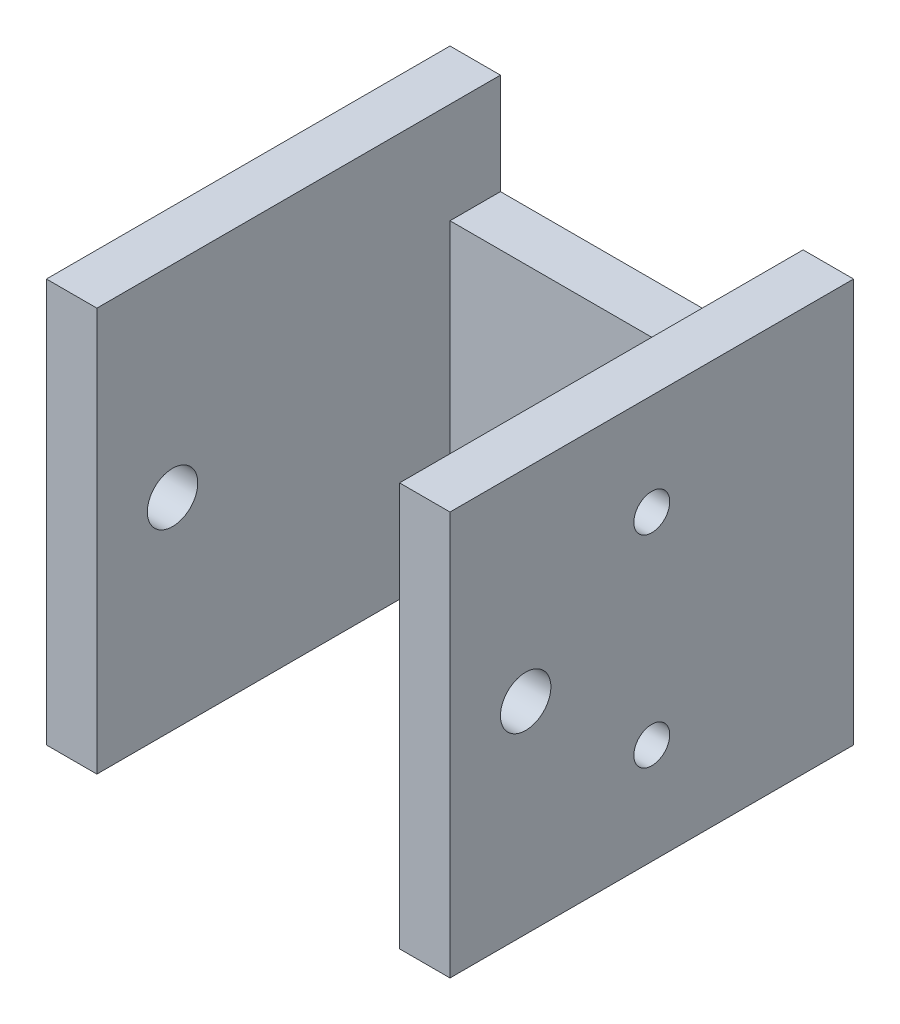
ISO-10303-21;
HEADER;
FILE_DESCRIPTION(('STEP AP214'),'2;1');
FILE_NAME('part.step','',(''),(''),'','','');
FILE_SCHEMA(('AUTOMOTIVE_DESIGN { 1 0 10303 214 1 1 1 1 }'));
ENDSEC;
DATA;
#1=APPLICATION_CONTEXT('core data for automotive mechanical design processes');
#2=APPLICATION_PROTOCOL_DEFINITION('international standard','automotive_design',2000,#1);
#3=PRODUCT_CONTEXT('',#1,'mechanical');
#4=PRODUCT('Part','Part','',(#3));
#5=PRODUCT_RELATED_PRODUCT_CATEGORY('part','',(#4));
#6=PRODUCT_DEFINITION_FORMATION('','',#4);
#7=PRODUCT_DEFINITION_CONTEXT('part definition',#1,'design');
#8=PRODUCT_DEFINITION('design','',#6,#7);
#9=PRODUCT_DEFINITION_SHAPE('','',#8);
#10=(LENGTH_UNIT() NAMED_UNIT(*) SI_UNIT(.MILLI.,.METRE.));
#11=(NAMED_UNIT(*) PLANE_ANGLE_UNIT() SI_UNIT($,.RADIAN.));
#12=(NAMED_UNIT(*) SI_UNIT($,.STERADIAN.) SOLID_ANGLE_UNIT());
#13=UNCERTAINTY_MEASURE_WITH_UNIT(LENGTH_MEASURE(1.E-05),#10,'distance_accuracy_value','');
#14=(GEOMETRIC_REPRESENTATION_CONTEXT(3) GLOBAL_UNCERTAINTY_ASSIGNED_CONTEXT((#13)) GLOBAL_UNIT_ASSIGNED_CONTEXT((#10,
#11,#12)) REPRESENTATION_CONTEXT('',''));
#15=CARTESIAN_POINT('',(0.,0.,0.));
#16=DIRECTION('',(0.,0.,1.));
#17=DIRECTION('',(1.,0.,0.));
#18=AXIS2_PLACEMENT_3D('',#15,#16,#17);
#19=CARTESIAN_POINT('',(0.,0.,0.));
#20=DIRECTION('',(0.,-1.,0.));
#21=DIRECTION('',(0.,0.,-1.));
#22=AXIS2_PLACEMENT_3D('',#19,#20,#21);
#23=PLANE('',#22);
#24=DIRECTION('',(-1.,0.,0.));
#25=VECTOR('',#24,1.);
#26=CARTESIAN_POINT('',(0.,0.,-25.4));
#27=LINE('',#26,#25);
#28=CARTESIAN_POINT('',(3.175,0.,-25.4));
#29=VERTEX_POINT('',#28);
#30=CARTESIAN_POINT('',(0.,0.,-25.4));
#31=VERTEX_POINT('',#30);
#32=EDGE_CURVE('E155',#29,#31,#27,.T.);
#33=ORIENTED_EDGE('',*,*,#32,.F.);
#34=DIRECTION('',(0.,0.,-1.));
#35=VECTOR('',#34,1.);
#36=CARTESIAN_POINT('',(3.175,0.,-22.225));
#37=LINE('',#36,#35);
#38=CARTESIAN_POINT('',(3.175,0.,0.));
#39=VERTEX_POINT('',#38);
#40=EDGE_CURVE('E147',#39,#29,#37,.T.);
#41=ORIENTED_EDGE('',*,*,#40,.F.);
#42=DIRECTION('',(1.,0.,0.));
#43=VECTOR('',#42,1.);
#44=CARTESIAN_POINT('',(3.175,0.,0.));
#45=LINE('',#44,#43);
#46=CARTESIAN_POINT('',(0.,0.,0.));
#47=VERTEX_POINT('',#46);
#48=EDGE_CURVE('E144',#47,#39,#45,.T.);
#49=ORIENTED_EDGE('',*,*,#48,.F.);
#50=DIRECTION('',(0.,0.,1.));
#51=VECTOR('',#50,1.);
#52=CARTESIAN_POINT('',(0.,0.,0.));
#53=LINE('',#52,#51);
#54=EDGE_CURVE('E89',#31,#47,#53,.T.);
#55=ORIENTED_EDGE('',*,*,#54,.F.);
#56=EDGE_LOOP('',(#33,#41,#49,#55));
#57=FACE_BOUND('',#56,.T.);
#58=ADVANCED_FACE('F39',(#57),#23,.T.);
#59=CARTESIAN_POINT('',(0.,25.4,0.));
#60=DIRECTION('',(0.,-1.,0.));
#61=DIRECTION('',(0.,0.,-1.));
#62=AXIS2_PLACEMENT_3D('',#59,#60,#61);
#63=PLANE('',#62);
#64=DIRECTION('',(0.,0.,-1.));
#65=VECTOR('',#64,1.);
#66=CARTESIAN_POINT('',(3.175,25.4,-22.225));
#67=LINE('',#66,#65);
#68=CARTESIAN_POINT('',(3.175,25.4,0.));
#69=VERTEX_POINT('',#68);
#70=CARTESIAN_POINT('',(3.175,25.4,-25.4));
#71=VERTEX_POINT('',#70);
#72=EDGE_CURVE('E97',#69,#71,#67,.T.);
#73=ORIENTED_EDGE('',*,*,#72,.T.);
#74=DIRECTION('',(-1.,0.,0.));
#75=VECTOR('',#74,1.);
#76=CARTESIAN_POINT('',(0.,25.4,-25.4));
#77=LINE('',#76,#75);
#78=CARTESIAN_POINT('',(0.,25.4,-25.4));
#79=VERTEX_POINT('',#78);
#80=EDGE_CURVE('E120',#71,#79,#77,.T.);
#81=ORIENTED_EDGE('',*,*,#80,.T.);
#82=DIRECTION('',(0.,0.,1.));
#83=VECTOR('',#82,1.);
#84=CARTESIAN_POINT('',(0.,25.4,0.));
#85=LINE('',#84,#83);
#86=CARTESIAN_POINT('',(0.,25.4,0.));
#87=VERTEX_POINT('',#86);
#88=EDGE_CURVE('E63',#79,#87,#85,.T.);
#89=ORIENTED_EDGE('',*,*,#88,.T.);
#90=DIRECTION('',(1.,0.,0.));
#91=VECTOR('',#90,1.);
#92=CARTESIAN_POINT('',(3.175,25.4,0.));
#93=LINE('',#92,#91);
#94=EDGE_CURVE('E159',#87,#69,#93,.T.);
#95=ORIENTED_EDGE('',*,*,#94,.T.);
#96=EDGE_LOOP('',(#73,#81,#89,#95));
#97=FACE_BOUND('',#96,.T.);
#98=ADVANCED_FACE('F209',(#97),#63,.F.);
#99=CARTESIAN_POINT('',(25.4,25.4,-25.4));
#100=DIRECTION('',(-1.,0.,0.));
#101=DIRECTION('',(0.,0.,1.));
#102=AXIS2_PLACEMENT_3D('',#99,#100,#101);
#103=PLANE('',#102);
#104=CARTESIAN_POINT('',(25.4,19.05,-12.7));
#105=DIRECTION('',(1.,0.,0.));
#106=DIRECTION('',(0.,0.,-1.));
#107=AXIS2_PLACEMENT_3D('',#104,#105,#106);
#108=CIRCLE('',#107,1.13029999999999);
#109=CARTESIAN_POINT('',(25.4,19.05,-13.8303));
#110=VERTEX_POINT('',#109);
#111=EDGE_CURVE('E254',#110,#110,#108,.T.);
#112=ORIENTED_EDGE('',*,*,#111,.F.);
#113=EDGE_LOOP('',(#112));
#114=FACE_BOUND('',#113,.T.);
#115=DIRECTION('',(0.,0.,-1.));
#116=VECTOR('',#115,1.);
#117=CARTESIAN_POINT('',(25.4,0.,-25.4));
#118=LINE('',#117,#116);
#119=CARTESIAN_POINT('',(25.4,0.,0.));
#120=VERTEX_POINT('',#119);
#121=CARTESIAN_POINT('',(25.4,0.,-25.4));
#122=VERTEX_POINT('',#121);
#123=EDGE_CURVE('E127',#120,#122,#118,.T.);
#124=ORIENTED_EDGE('',*,*,#123,.T.);
#125=DIRECTION('',(0.,-1.,0.));
#126=VECTOR('',#125,1.);
#127=CARTESIAN_POINT('',(25.4,25.4,-25.4));
#128=LINE('',#127,#126);
#129=CARTESIAN_POINT('',(25.4,25.4,-25.4));
#130=VERTEX_POINT('',#129);
#131=EDGE_CURVE('E123',#130,#122,#128,.T.);
#132=ORIENTED_EDGE('',*,*,#131,.F.);
#133=DIRECTION('',(0.,0.,-1.));
#134=VECTOR('',#133,1.);
#135=CARTESIAN_POINT('',(25.4,25.4,-25.4));
#136=LINE('',#135,#134);
#137=CARTESIAN_POINT('',(25.4,25.4,0.));
#138=VERTEX_POINT('',#137);
#139=EDGE_CURVE('E109',#138,#130,#136,.T.);
#140=ORIENTED_EDGE('',*,*,#139,.F.);
#141=DIRECTION('',(0.,-1.,0.));
#142=VECTOR('',#141,1.);
#143=CARTESIAN_POINT('',(25.4,25.4,0.));
#144=LINE('',#143,#142);
#145=EDGE_CURVE('E130',#138,#120,#144,.T.);
#146=ORIENTED_EDGE('',*,*,#145,.T.);
#147=EDGE_LOOP('',(#124,#132,#140,#146));
#148=FACE_BOUND('',#147,.T.);
#149=CARTESIAN_POINT('',(25.4,12.7,-4.7625));
#150=DIRECTION('',(-1.,0.,0.));
#151=DIRECTION('',(0.,0.,1.));
#152=AXIS2_PLACEMENT_3D('',#149,#150,#151);
#153=CIRCLE('',#152,1.58749999999998);
#154=CARTESIAN_POINT('',(25.4,12.7,-3.17500000000001));
#155=VERTEX_POINT('',#154);
#156=EDGE_CURVE('E269',#155,#155,#153,.T.);
#157=ORIENTED_EDGE('',*,*,#156,.T.);
#158=EDGE_LOOP('',(#157));
#159=FACE_BOUND('',#158,.T.);
#160=CARTESIAN_POINT('',(25.4,6.35,-12.7));
#161=DIRECTION('',(1.,0.,0.));
#162=DIRECTION('',(0.,0.,-1.));
#163=AXIS2_PLACEMENT_3D('',#160,#161,#162);
#164=CIRCLE('',#163,1.13029999999999);
#165=CARTESIAN_POINT('',(25.4,6.35,-13.8303));
#166=VERTEX_POINT('',#165);
#167=EDGE_CURVE('E260',#166,#166,#164,.T.);
#168=ORIENTED_EDGE('',*,*,#167,.F.);
#169=EDGE_LOOP('',(#168));
#170=FACE_BOUND('',#169,.T.);
#171=ADVANCED_FACE('F124',(#114,#148,#159,#170),#103,.F.);
#172=CARTESIAN_POINT('',(3.175,25.4,0.));
#173=DIRECTION('',(0.,0.,-1.));
#174=DIRECTION('',(-1.,0.,0.));
#175=AXIS2_PLACEMENT_3D('',#172,#173,#174);
#176=PLANE('',#175);
#177=ORIENTED_EDGE('',*,*,#48,.T.);
#178=DIRECTION('',(0.,-1.,0.));
#179=VECTOR('',#178,1.);
#180=CARTESIAN_POINT('',(3.175,25.4,0.));
#181=LINE('',#180,#179);
#182=EDGE_CURVE('E11',#69,#39,#181,.T.);
#183=ORIENTED_EDGE('',*,*,#182,.F.);
#184=ORIENTED_EDGE('',*,*,#94,.F.);
#185=DIRECTION('',(0.,-1.,0.));
#186=VECTOR('',#185,1.);
#187=CARTESIAN_POINT('',(0.,25.4,0.));
#188=LINE('',#187,#186);
#189=EDGE_CURVE('E140',#87,#47,#188,.T.);
#190=ORIENTED_EDGE('',*,*,#189,.T.);
#191=EDGE_LOOP('',(#177,#183,#184,#190));
#192=FACE_BOUND('',#191,.T.);
#193=ADVANCED_FACE('F41',(#192),#176,.F.);
#194=CARTESIAN_POINT('',(3.175,25.4,-22.225));
#195=DIRECTION('',(-1.,0.,0.));
#196=DIRECTION('',(0.,0.,1.));
#197=AXIS2_PLACEMENT_3D('',#194,#195,#196);
#198=PLANE('',#197);
#199=CARTESIAN_POINT('',(3.175,12.7,-4.7625));
#200=DIRECTION('',(-1.,0.,0.));
#201=DIRECTION('',(0.,0.,1.));
#202=AXIS2_PLACEMENT_3D('',#199,#200,#201);
#203=CIRCLE('',#202,1.58749999999999);
#204=CARTESIAN_POINT('',(3.175,12.7,-3.17500000000001));
#205=VERTEX_POINT('',#204);
#206=EDGE_CURVE('E148',#205,#205,#203,.T.);
#207=ORIENTED_EDGE('',*,*,#206,.T.);
#208=EDGE_LOOP('',(#207));
#209=FACE_BOUND('',#208,.T.);
#210=ORIENTED_EDGE('',*,*,#40,.T.);
#211=DIRECTION('',(0.,1.,0.));
#212=VECTOR('',#211,1.);
#213=CARTESIAN_POINT('',(3.175,0.,-25.4));
#214=LINE('',#213,#212);
#215=CARTESIAN_POINT('',(3.175,6.35,-25.4));
#216=VERTEX_POINT('',#215);
#217=EDGE_CURVE('E238',#29,#216,#214,.T.);
#218=ORIENTED_EDGE('',*,*,#217,.T.);
#219=DIRECTION('',(0.,0.,1.));
#220=VECTOR('',#219,1.);
#221=CARTESIAN_POINT('',(3.175,6.35,-25.401));
#222=LINE('',#221,#220);
#223=CARTESIAN_POINT('',(3.175,6.35,-22.225));
#224=VERTEX_POINT('',#223);
#225=EDGE_CURVE('E193',#216,#224,#222,.T.);
#226=ORIENTED_EDGE('',*,*,#225,.T.);
#227=DIRECTION('',(0.,-1.,0.));
#228=VECTOR('',#227,1.);
#229=CARTESIAN_POINT('',(3.175,25.4,-22.225));
#230=LINE('',#229,#228);
#231=CARTESIAN_POINT('',(3.175,19.05,-22.225));
#232=VERTEX_POINT('',#231);
#233=EDGE_CURVE('E47',#232,#224,#230,.T.);
#234=ORIENTED_EDGE('',*,*,#233,.F.);
#235=DIRECTION('',(0.,0.,1.));
#236=VECTOR('',#235,1.);
#237=CARTESIAN_POINT('',(3.175,19.05,-25.401));
#238=LINE('',#237,#236);
#239=CARTESIAN_POINT('',(3.175,19.05,-25.4));
#240=VERTEX_POINT('',#239);
#241=EDGE_CURVE('E189',#240,#232,#238,.T.);
#242=ORIENTED_EDGE('',*,*,#241,.F.);
#243=DIRECTION('',(0.,1.,0.));
#244=VECTOR('',#243,1.);
#245=CARTESIAN_POINT('',(3.175,25.4,-25.4));
#246=LINE('',#245,#244);
#247=EDGE_CURVE('E216',#240,#71,#246,.T.);
#248=ORIENTED_EDGE('',*,*,#247,.T.);
#249=ORIENTED_EDGE('',*,*,#72,.F.);
#250=ORIENTED_EDGE('',*,*,#182,.T.);
#251=EDGE_LOOP('',(#210,#218,#226,#234,#242,#248,#249,#250));
#252=FACE_BOUND('',#251,.T.);
#253=ADVANCED_FACE('F186',(#209,#252),#198,.F.);
#254=CARTESIAN_POINT('',(22.225,25.4,-22.225));
#255=DIRECTION('',(0.,0.,-1.));
#256=DIRECTION('',(-1.,0.,0.));
#257=AXIS2_PLACEMENT_3D('',#254,#255,#256);
#258=PLANE('',#257);
#259=ORIENTED_EDGE('',*,*,#233,.T.);
#260=DIRECTION('',(-1.,0.,0.));
#261=VECTOR('',#260,1.);
#262=CARTESIAN_POINT('',(3.175,6.35,-22.225));
#263=LINE('',#262,#261);
#264=CARTESIAN_POINT('',(22.225,6.35,-22.225));
#265=VERTEX_POINT('',#264);
#266=EDGE_CURVE('E178',#265,#224,#263,.T.);
#267=ORIENTED_EDGE('',*,*,#266,.F.);
#268=DIRECTION('',(0.,-1.,0.));
#269=VECTOR('',#268,1.);
#270=CARTESIAN_POINT('',(22.225,25.4,-22.225));
#271=LINE('',#270,#269);
#272=CARTESIAN_POINT('',(22.225,19.05,-22.225));
#273=VERTEX_POINT('',#272);
#274=EDGE_CURVE('E166',#273,#265,#271,.T.);
#275=ORIENTED_EDGE('',*,*,#274,.F.);
#276=DIRECTION('',(1.,0.,0.));
#277=VECTOR('',#276,1.);
#278=CARTESIAN_POINT('',(3.175,19.05,-22.225));
#279=LINE('',#278,#277);
#280=EDGE_CURVE('E181',#232,#273,#279,.T.);
#281=ORIENTED_EDGE('',*,*,#280,.F.);
#282=EDGE_LOOP('',(#259,#267,#275,#281));
#283=FACE_BOUND('',#282,.T.);
#284=ADVANCED_FACE('F174',(#283),#258,.F.);
#285=CARTESIAN_POINT('',(22.225,25.4,0.));
#286=DIRECTION('',(1.,0.,0.));
#287=DIRECTION('',(0.,0.,-1.));
#288=AXIS2_PLACEMENT_3D('',#285,#286,#287);
#289=PLANE('',#288);
#290=CARTESIAN_POINT('',(22.225,19.05,-12.7));
#291=DIRECTION('',(1.,0.,0.));
#292=DIRECTION('',(0.,0.,-1.));
#293=AXIS2_PLACEMENT_3D('',#290,#291,#292);
#294=CIRCLE('',#293,1.13029999999999);
#295=CARTESIAN_POINT('',(22.225,19.05,-13.8303));
#296=VERTEX_POINT('',#295);
#297=EDGE_CURVE('E257',#296,#296,#294,.T.);
#298=ORIENTED_EDGE('',*,*,#297,.T.);
#299=EDGE_LOOP('',(#298));
#300=FACE_BOUND('',#299,.T.);
#301=CARTESIAN_POINT('',(22.225,6.35,-12.7));
#302=DIRECTION('',(1.,0.,0.));
#303=DIRECTION('',(0.,0.,-1.));
#304=AXIS2_PLACEMENT_3D('',#301,#302,#303);
#305=CIRCLE('',#304,1.13029999999999);
#306=CARTESIAN_POINT('',(22.225,6.35,-13.8303));
#307=VERTEX_POINT('',#306);
#308=EDGE_CURVE('E263',#307,#307,#305,.T.);
#309=ORIENTED_EDGE('',*,*,#308,.T.);
#310=EDGE_LOOP('',(#309));
#311=FACE_BOUND('',#310,.T.);
#312=CARTESIAN_POINT('',(22.225,12.7,-4.7625));
#313=DIRECTION('',(1.,0.,0.));
#314=DIRECTION('',(0.,0.,-1.));
#315=AXIS2_PLACEMENT_3D('',#312,#313,#314);
#316=CIRCLE('',#315,1.58749999999999);
#317=CARTESIAN_POINT('',(22.225,12.7,-6.34999999999999));
#318=VERTEX_POINT('',#317);
#319=EDGE_CURVE('E271',#318,#318,#316,.T.);
#320=ORIENTED_EDGE('',*,*,#319,.T.);
#321=EDGE_LOOP('',(#320));
#322=FACE_BOUND('',#321,.T.);
#323=DIRECTION('',(0.,0.,1.));
#324=VECTOR('',#323,1.);
#325=CARTESIAN_POINT('',(22.225,0.,0.));
#326=LINE('',#325,#324);
#327=CARTESIAN_POINT('',(22.225,0.,-25.4));
#328=VERTEX_POINT('',#327);
#329=CARTESIAN_POINT('',(22.225,0.,0.));
#330=VERTEX_POINT('',#329);
#331=EDGE_CURVE('E54',#328,#330,#326,.T.);
#332=ORIENTED_EDGE('',*,*,#331,.T.);
#333=DIRECTION('',(0.,-1.,0.));
#334=VECTOR('',#333,1.);
#335=CARTESIAN_POINT('',(22.225,25.4,0.));
#336=LINE('',#335,#334);
#337=CARTESIAN_POINT('',(22.225,25.4,0.));
#338=VERTEX_POINT('',#337);
#339=EDGE_CURVE('E163',#338,#330,#336,.T.);
#340=ORIENTED_EDGE('',*,*,#339,.F.);
#341=DIRECTION('',(0.,0.,1.));
#342=VECTOR('',#341,1.);
#343=CARTESIAN_POINT('',(22.225,25.4,0.));
#344=LINE('',#343,#342);
#345=CARTESIAN_POINT('',(22.225,25.4,-25.4));
#346=VERTEX_POINT('',#345);
#347=EDGE_CURVE('E208',#346,#338,#344,.T.);
#348=ORIENTED_EDGE('',*,*,#347,.F.);
#349=DIRECTION('',(0.,-1.,0.));
#350=VECTOR('',#349,1.);
#351=CARTESIAN_POINT('',(22.225,25.4,-25.4));
#352=LINE('',#351,#350);
#353=CARTESIAN_POINT('',(22.225,19.05,-25.4));
#354=VERTEX_POINT('',#353);
#355=EDGE_CURVE('E138',#346,#354,#352,.T.);
#356=ORIENTED_EDGE('',*,*,#355,.T.);
#357=DIRECTION('',(0.,0.,1.));
#358=VECTOR('',#357,1.);
#359=CARTESIAN_POINT('',(22.225,19.05,-25.401));
#360=LINE('',#359,#358);
#361=EDGE_CURVE('E249',#354,#273,#360,.T.);
#362=ORIENTED_EDGE('',*,*,#361,.T.);
#363=ORIENTED_EDGE('',*,*,#274,.T.);
#364=DIRECTION('',(0.,0.,1.));
#365=VECTOR('',#364,1.);
#366=CARTESIAN_POINT('',(22.225,6.35,-25.401));
#367=LINE('',#366,#365);
#368=CARTESIAN_POINT('',(22.225,6.35,-25.4));
#369=VERTEX_POINT('',#368);
#370=EDGE_CURVE('E243',#369,#265,#367,.T.);
#371=ORIENTED_EDGE('',*,*,#370,.F.);
#372=DIRECTION('',(0.,-1.,0.));
#373=VECTOR('',#372,1.);
#374=CARTESIAN_POINT('',(22.225,0.,-25.4));
#375=LINE('',#374,#373);
#376=EDGE_CURVE('E232',#369,#328,#375,.T.);
#377=ORIENTED_EDGE('',*,*,#376,.T.);
#378=EDGE_LOOP('',(#332,#340,#348,#356,#362,#363,#371,#377));
#379=FACE_BOUND('',#378,.T.);
#380=ADVANCED_FACE('F227',(#300,#311,#322,#379),#289,.F.);
#381=CARTESIAN_POINT('',(25.4,25.4,0.));
#382=DIRECTION('',(0.,0.,-1.));
#383=DIRECTION('',(-1.,0.,0.));
#384=AXIS2_PLACEMENT_3D('',#381,#382,#383);
#385=PLANE('',#384);
#386=DIRECTION('',(1.,0.,0.));
#387=VECTOR('',#386,1.);
#388=CARTESIAN_POINT('',(25.4,0.,0.));
#389=LINE('',#388,#387);
#390=EDGE_CURVE('E152',#330,#120,#389,.T.);
#391=ORIENTED_EDGE('',*,*,#390,.T.);
#392=ORIENTED_EDGE('',*,*,#145,.F.);
#393=DIRECTION('',(1.,0.,0.));
#394=VECTOR('',#393,1.);
#395=CARTESIAN_POINT('',(25.4,25.4,0.));
#396=LINE('',#395,#394);
#397=EDGE_CURVE('E116',#338,#138,#396,.T.);
#398=ORIENTED_EDGE('',*,*,#397,.F.);
#399=ORIENTED_EDGE('',*,*,#339,.T.);
#400=EDGE_LOOP('',(#391,#392,#398,#399));
#401=FACE_BOUND('',#400,.T.);
#402=ADVANCED_FACE('F229',(#401),#385,.F.);
#403=CARTESIAN_POINT('',(0.,25.4,-25.4));
#404=DIRECTION('',(0.,0.,1.));
#405=DIRECTION('',(1.,0.,0.));
#406=AXIS2_PLACEMENT_3D('',#403,#404,#405);
#407=PLANE('',#406);
#408=DIRECTION('',(1.,0.,0.));
#409=VECTOR('',#408,1.);
#410=CARTESIAN_POINT('',(3.175,6.35,-25.4));
#411=LINE('',#410,#409);
#412=EDGE_CURVE('E234',#216,#369,#411,.T.);
#413=ORIENTED_EDGE('',*,*,#412,.F.);
#414=ORIENTED_EDGE('',*,*,#217,.F.);
#415=ORIENTED_EDGE('',*,*,#32,.T.);
#416=DIRECTION('',(0.,-1.,0.));
#417=VECTOR('',#416,1.);
#418=CARTESIAN_POINT('',(0.,25.4,-25.4));
#419=LINE('',#418,#417);
#420=EDGE_CURVE('E131',#79,#31,#419,.T.);
#421=ORIENTED_EDGE('',*,*,#420,.F.);
#422=ORIENTED_EDGE('',*,*,#80,.F.);
#423=ORIENTED_EDGE('',*,*,#247,.F.);
#424=DIRECTION('',(-1.,0.,0.));
#425=VECTOR('',#424,1.);
#426=CARTESIAN_POINT('',(3.175,19.05,-25.4));
#427=LINE('',#426,#425);
#428=EDGE_CURVE('E251',#354,#240,#427,.T.);
#429=ORIENTED_EDGE('',*,*,#428,.F.);
#430=ORIENTED_EDGE('',*,*,#355,.F.);
#431=EDGE_CURVE('E114',#130,#346,#77,.T.);
#432=ORIENTED_EDGE('',*,*,#431,.F.);
#433=ORIENTED_EDGE('',*,*,#131,.T.);
#434=EDGE_CURVE('E156',#122,#328,#27,.T.);
#435=ORIENTED_EDGE('',*,*,#434,.T.);
#436=ORIENTED_EDGE('',*,*,#376,.F.);
#437=EDGE_LOOP('',(#413,#414,#415,#421,#422,#423,#429,#430,#432,#433,#435,#436));
#438=FACE_BOUND('',#437,.T.);
#439=ADVANCED_FACE('F135',(#438),#407,.F.);
#440=CARTESIAN_POINT('',(0.,25.4,0.));
#441=DIRECTION('',(1.,0.,0.));
#442=DIRECTION('',(0.,0.,-1.));
#443=AXIS2_PLACEMENT_3D('',#440,#441,#442);
#444=PLANE('',#443);
#445=CARTESIAN_POINT('',(0.,12.7,-4.7625));
#446=DIRECTION('',(-1.,0.,0.));
#447=DIRECTION('',(0.,0.,1.));
#448=AXIS2_PLACEMENT_3D('',#445,#446,#447);
#449=CIRCLE('',#448,1.58749999999999);
#450=CARTESIAN_POINT('',(0.,12.7,-3.17500000000001));
#451=VERTEX_POINT('',#450);
#452=EDGE_CURVE('E266',#451,#451,#449,.T.);
#453=ORIENTED_EDGE('',*,*,#452,.F.);
#454=EDGE_LOOP('',(#453));
#455=FACE_BOUND('',#454,.T.);
#456=ORIENTED_EDGE('',*,*,#54,.T.);
#457=ORIENTED_EDGE('',*,*,#189,.F.);
#458=ORIENTED_EDGE('',*,*,#88,.F.);
#459=ORIENTED_EDGE('',*,*,#420,.T.);
#460=EDGE_LOOP('',(#456,#457,#458,#459));
#461=FACE_BOUND('',#460,.T.);
#462=ADVANCED_FACE('F220',(#455,#461),#444,.F.);
#463=ORIENTED_EDGE('',*,*,#431,.T.);
#464=ORIENTED_EDGE('',*,*,#347,.T.);
#465=ORIENTED_EDGE('',*,*,#397,.T.);
#466=ORIENTED_EDGE('',*,*,#139,.T.);
#467=EDGE_LOOP('',(#463,#464,#465,#466));
#468=FACE_BOUND('',#467,.T.);
#469=ADVANCED_FACE('F111',(#468),#63,.F.);
#470=ORIENTED_EDGE('',*,*,#331,.F.);
#471=ORIENTED_EDGE('',*,*,#434,.F.);
#472=ORIENTED_EDGE('',*,*,#123,.F.);
#473=ORIENTED_EDGE('',*,*,#390,.F.);
#474=EDGE_LOOP('',(#470,#471,#472,#473));
#475=FACE_BOUND('',#474,.T.);
#476=ADVANCED_FACE('F230',(#475),#23,.T.);
#477=CARTESIAN_POINT('',(0.,12.7,-4.7625));
#478=DIRECTION('',(-1.,0.,0.));
#479=DIRECTION('',(0.,0.,1.));
#480=AXIS2_PLACEMENT_3D('',#477,#478,#479);
#481=CYLINDRICAL_SURFACE('',#480,1.58749999999999);
#482=ORIENTED_EDGE('',*,*,#452,.T.);
#483=EDGE_LOOP('',(#482));
#484=FACE_BOUND('',#483,.T.);
#485=ORIENTED_EDGE('',*,*,#206,.F.);
#486=EDGE_LOOP('',(#485));
#487=FACE_BOUND('',#486,.T.);
#488=ADVANCED_FACE('F279',(#484,#487),#481,.F.);
#489=ORIENTED_EDGE('',*,*,#156,.F.);
#490=EDGE_LOOP('',(#489));
#491=FACE_BOUND('',#490,.T.);
#492=ORIENTED_EDGE('',*,*,#319,.F.);
#493=EDGE_LOOP('',(#492));
#494=FACE_BOUND('',#493,.T.);
#495=ADVANCED_FACE('F281',(#491,#494),#481,.F.);
#496=CARTESIAN_POINT('',(25.4,6.35,-12.7));
#497=DIRECTION('',(1.,0.,0.));
#498=DIRECTION('',(0.,0.,-1.));
#499=AXIS2_PLACEMENT_3D('',#496,#497,#498);
#500=CYLINDRICAL_SURFACE('',#499,1.13029999999999);
#501=ORIENTED_EDGE('',*,*,#308,.F.);
#502=EDGE_LOOP('',(#501));
#503=FACE_BOUND('',#502,.T.);
#504=ORIENTED_EDGE('',*,*,#167,.T.);
#505=EDGE_LOOP('',(#504));
#506=FACE_BOUND('',#505,.T.);
#507=ADVANCED_FACE('F288',(#503,#506),#500,.F.);
#508=CARTESIAN_POINT('',(25.4,19.05,-12.7));
#509=DIRECTION('',(1.,0.,0.));
#510=DIRECTION('',(0.,0.,-1.));
#511=AXIS2_PLACEMENT_3D('',#508,#509,#510);
#512=CYLINDRICAL_SURFACE('',#511,1.13029999999999);
#513=ORIENTED_EDGE('',*,*,#297,.F.);
#514=EDGE_LOOP('',(#513));
#515=FACE_BOUND('',#514,.T.);
#516=ORIENTED_EDGE('',*,*,#111,.T.);
#517=EDGE_LOOP('',(#516));
#518=FACE_BOUND('',#517,.T.);
#519=ADVANCED_FACE('F369',(#515,#518),#512,.F.);
#520=CARTESIAN_POINT('',(3.175,19.05,-25.401));
#521=DIRECTION('',(0.,-1.,0.));
#522=DIRECTION('',(0.,0.,-1.));
#523=AXIS2_PLACEMENT_3D('',#520,#521,#522);
#524=PLANE('',#523);
#525=ORIENTED_EDGE('',*,*,#428,.T.);
#526=ORIENTED_EDGE('',*,*,#241,.T.);
#527=ORIENTED_EDGE('',*,*,#280,.T.);
#528=ORIENTED_EDGE('',*,*,#361,.F.);
#529=EDGE_LOOP('',(#525,#526,#527,#528));
#530=FACE_BOUND('',#529,.T.);
#531=ADVANCED_FACE('F363',(#530),#524,.F.);
#532=CARTESIAN_POINT('',(3.175,6.35,-25.401));
#533=DIRECTION('',(0.,1.,0.));
#534=DIRECTION('',(-1.,0.,0.));
#535=AXIS2_PLACEMENT_3D('',#532,#533,#534);
#536=PLANE('',#535);
#537=ORIENTED_EDGE('',*,*,#412,.T.);
#538=ORIENTED_EDGE('',*,*,#370,.T.);
#539=ORIENTED_EDGE('',*,*,#266,.T.);
#540=ORIENTED_EDGE('',*,*,#225,.F.);
#541=EDGE_LOOP('',(#537,#538,#539,#540));
#542=FACE_BOUND('',#541,.T.);
#543=ADVANCED_FACE('F368',(#542),#536,.F.);
#544=CLOSED_SHELL('',(#58,#98,#171,#193,#253,#284,#380,#402,#439,#462,#469,#476,#488,#495,#507,
#519,#531,#543));
#545=MANIFOLD_SOLID_BREP('B2',#544);
#546=ADVANCED_BREP_SHAPE_REPRESENTATION('',(#18,#545),#14);
#547=SHAPE_DEFINITION_REPRESENTATION(#9,#546);
ENDSEC;
END-ISO-10303-21;
